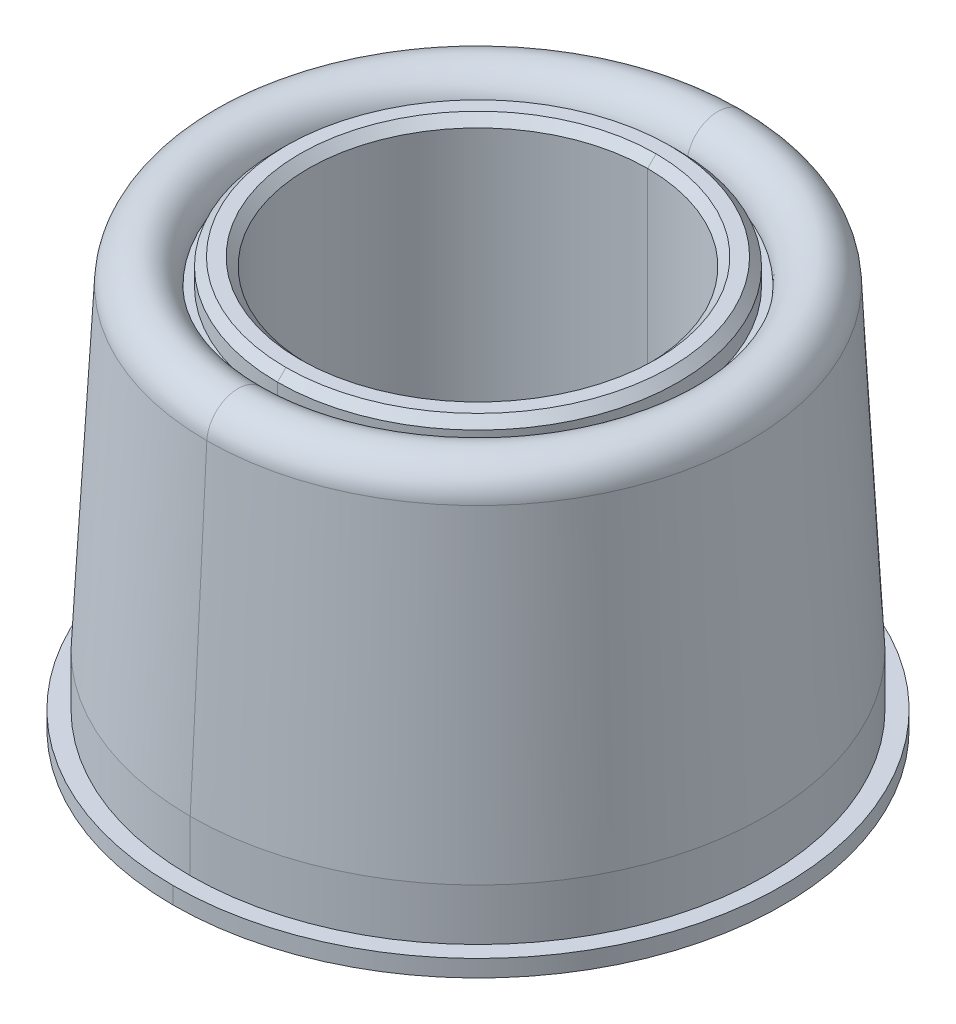
ISO-10303-21;
HEADER;
FILE_DESCRIPTION(('STEP AP214'),'2;1');
FILE_NAME('part.step','',(''),(''),'','','');
FILE_SCHEMA(('AUTOMOTIVE_DESIGN { 1 0 10303 214 1 1 1 1 }'));
ENDSEC;
DATA;
#1=APPLICATION_CONTEXT('core data for automotive mechanical design processes');
#2=APPLICATION_PROTOCOL_DEFINITION('international standard','automotive_design',2000,#1);
#3=PRODUCT_CONTEXT('',#1,'mechanical');
#4=PRODUCT('Part','Part','',(#3));
#5=PRODUCT_RELATED_PRODUCT_CATEGORY('part','',(#4));
#6=PRODUCT_DEFINITION_FORMATION('','',#4);
#7=PRODUCT_DEFINITION_CONTEXT('part definition',#1,'design');
#8=PRODUCT_DEFINITION('design','',#6,#7);
#9=PRODUCT_DEFINITION_SHAPE('','',#8);
#10=(LENGTH_UNIT() NAMED_UNIT(*) SI_UNIT(.MILLI.,.METRE.));
#11=(NAMED_UNIT(*) PLANE_ANGLE_UNIT() SI_UNIT($,.RADIAN.));
#12=(NAMED_UNIT(*) SI_UNIT($,.STERADIAN.) SOLID_ANGLE_UNIT());
#13=UNCERTAINTY_MEASURE_WITH_UNIT(LENGTH_MEASURE(1.E-05),#10,'distance_accuracy_value','');
#14=(GEOMETRIC_REPRESENTATION_CONTEXT(3) GLOBAL_UNCERTAINTY_ASSIGNED_CONTEXT((#13)) GLOBAL_UNIT_ASSIGNED_CONTEXT((#10,
#11,#12)) REPRESENTATION_CONTEXT('',''));
#15=CARTESIAN_POINT('',(0.,0.,0.));
#16=DIRECTION('',(0.,0.,1.));
#17=DIRECTION('',(1.,0.,0.));
#18=AXIS2_PLACEMENT_3D('',#15,#16,#17);
#19=CARTESIAN_POINT('',(0.,9.0424,0.));
#20=DIRECTION('',(0.,1.,0.));
#21=DIRECTION('',(0.,0.,1.));
#22=AXIS2_PLACEMENT_3D('',#19,#20,#21);
#23=CONICAL_SURFACE('',#22,8.34771,0.785398163397443);
#24=DIRECTION('',(0.,0.707106781186551,-0.707106781186545));
#25=VECTOR('',#24,1.);
#26=CARTESIAN_POINT('',(0.,9.0424,-8.34771));
#27=LINE('',#26,#25);
#28=CARTESIAN_POINT('',(0.,8.64489,-7.9502));
#29=VERTEX_POINT('',#28);
#30=CARTESIAN_POINT('',(0.,9.0424,-8.34771));
#31=VERTEX_POINT('',#30);
#32=EDGE_CURVE('E411',#29,#31,#27,.T.);
#33=ORIENTED_EDGE('',*,*,#32,.F.);
#34=CARTESIAN_POINT('',(0.,8.64489,0.));
#35=DIRECTION('',(0.,1.,0.));
#36=DIRECTION('',(0.,0.,-1.));
#37=AXIS2_PLACEMENT_3D('',#34,#35,#36);
#38=CIRCLE('',#37,7.9502);
#39=CARTESIAN_POINT('',(0.,8.64489,7.9502));
#40=VERTEX_POINT('',#39);
#41=EDGE_CURVE('E19',#40,#29,#38,.T.);
#42=ORIENTED_EDGE('',*,*,#41,.F.);
#43=DIRECTION('',(0.,0.707106781186551,0.707106781186545));
#44=VECTOR('',#43,1.);
#45=CARTESIAN_POINT('',(0.,9.0424,8.34771));
#46=LINE('',#45,#44);
#47=CARTESIAN_POINT('',(0.,9.0424,8.34771));
#48=VERTEX_POINT('',#47);
#49=EDGE_CURVE('E285',#40,#48,#46,.T.);
#50=ORIENTED_EDGE('',*,*,#49,.T.);
#51=CARTESIAN_POINT('',(0.,9.0424,0.));
#52=DIRECTION('',(0.,-1.,0.));
#53=DIRECTION('',(0.,0.,-1.));
#54=AXIS2_PLACEMENT_3D('',#51,#52,#53);
#55=CIRCLE('',#54,8.34771);
#56=EDGE_CURVE('E199',#31,#48,#55,.T.);
#57=ORIENTED_EDGE('',*,*,#56,.F.);
#58=EDGE_LOOP('',(#33,#42,#50,#57));
#59=FACE_BOUND('',#58,.T.);
#60=ADVANCED_FACE('F16',(#59),#23,.F.);
#61=CARTESIAN_POINT('',(0.,-8.64489,0.));
#62=DIRECTION('',(0.,-1.,0.));
#63=DIRECTION('',(0.,0.,-1.));
#64=AXIS2_PLACEMENT_3D('',#61,#62,#63);
#65=CONICAL_SURFACE('',#64,7.9502,0.785398163397457);
#66=DIRECTION('',(0.,-0.707106781186541,0.707106781186554));
#67=VECTOR('',#66,1.);
#68=CARTESIAN_POINT('',(0.,-8.64489,7.9502));
#69=LINE('',#68,#67);
#70=CARTESIAN_POINT('',(0.,-8.64489,7.9502));
#71=VERTEX_POINT('',#70);
#72=CARTESIAN_POINT('',(0.,-9.0424,8.34771));
#73=VERTEX_POINT('',#72);
#74=EDGE_CURVE('E293',#71,#73,#69,.T.);
#75=ORIENTED_EDGE('',*,*,#74,.F.);
#76=CARTESIAN_POINT('',(0.,-8.64489,0.));
#77=DIRECTION('',(0.,-1.,0.));
#78=DIRECTION('',(0.,0.,1.));
#79=AXIS2_PLACEMENT_3D('',#76,#77,#78);
#80=CIRCLE('',#79,7.9502);
#81=CARTESIAN_POINT('',(0.,-8.64489,-7.9502));
#82=VERTEX_POINT('',#81);
#83=EDGE_CURVE('E10',#82,#71,#80,.T.);
#84=ORIENTED_EDGE('',*,*,#83,.F.);
#85=DIRECTION('',(0.,-0.707106781186541,-0.707106781186554));
#86=VECTOR('',#85,1.);
#87=CARTESIAN_POINT('',(0.,-8.64489,-7.9502));
#88=LINE('',#87,#86);
#89=CARTESIAN_POINT('',(0.,-9.0424,-8.34771));
#90=VERTEX_POINT('',#89);
#91=EDGE_CURVE('E292',#82,#90,#88,.T.);
#92=ORIENTED_EDGE('',*,*,#91,.T.);
#93=CARTESIAN_POINT('',(0.,-9.0424,0.));
#94=DIRECTION('',(0.,1.,0.));
#95=DIRECTION('',(0.,0.,1.));
#96=AXIS2_PLACEMENT_3D('',#93,#94,#95);
#97=CIRCLE('',#96,8.34771);
#98=EDGE_CURVE('E205',#73,#90,#97,.T.);
#99=ORIENTED_EDGE('',*,*,#98,.F.);
#100=EDGE_LOOP('',(#75,#84,#92,#99));
#101=FACE_BOUND('',#100,.T.);
#102=ADVANCED_FACE('F399',(#101),#65,.F.);
#103=CARTESIAN_POINT('',(0.,8.64489,0.));
#104=DIRECTION('',(0.,-1.,0.));
#105=DIRECTION('',(0.,0.,-1.));
#106=AXIS2_PLACEMENT_3D('',#103,#104,#105);
#107=CONICAL_SURFACE('',#106,9.398,0.785398163397457);
#108=DIRECTION('',(0.,-0.707106781186541,0.707106781186554));
#109=VECTOR('',#108,1.);
#110=CARTESIAN_POINT('',(0.,8.64489,9.398));
#111=LINE('',#110,#109);
#112=CARTESIAN_POINT('',(0.,9.0424,9.00049));
#113=VERTEX_POINT('',#112);
#114=CARTESIAN_POINT('',(0.,8.64489,9.398));
#115=VERTEX_POINT('',#114);
#116=EDGE_CURVE('E304',#113,#115,#111,.T.);
#117=ORIENTED_EDGE('',*,*,#116,.F.);
#118=CARTESIAN_POINT('',(0.,9.0424,0.));
#119=DIRECTION('',(0.,1.,0.));
#120=DIRECTION('',(0.,0.,-1.));
#121=AXIS2_PLACEMENT_3D('',#118,#119,#120);
#122=CIRCLE('',#121,9.00049);
#123=CARTESIAN_POINT('',(0.,9.0424,-9.00049));
#124=VERTEX_POINT('',#123);
#125=EDGE_CURVE('E198',#124,#113,#122,.T.);
#126=ORIENTED_EDGE('',*,*,#125,.F.);
#127=DIRECTION('',(0.,-0.707106781186541,-0.707106781186554));
#128=VECTOR('',#127,1.);
#129=CARTESIAN_POINT('',(0.,8.64489,-9.398));
#130=LINE('',#129,#128);
#131=CARTESIAN_POINT('',(0.,8.64489,-9.398));
#132=VERTEX_POINT('',#131);
#133=EDGE_CURVE('E309',#124,#132,#130,.T.);
#134=ORIENTED_EDGE('',*,*,#133,.T.);
#135=CARTESIAN_POINT('',(0.,8.64489,0.));
#136=DIRECTION('',(0.,-1.,0.));
#137=DIRECTION('',(0.,0.,-1.));
#138=AXIS2_PLACEMENT_3D('',#135,#136,#137);
#139=CIRCLE('',#138,9.398);
#140=EDGE_CURVE('E195',#115,#132,#139,.T.);
#141=ORIENTED_EDGE('',*,*,#140,.F.);
#142=EDGE_LOOP('',(#117,#126,#134,#141));
#143=FACE_BOUND('',#142,.T.);
#144=ADVANCED_FACE('F404',(#143),#107,.T.);
#145=CARTESIAN_POINT('',(0.,-9.0424,0.));
#146=DIRECTION('',(0.,1.,0.));
#147=DIRECTION('',(0.,0.,1.));
#148=AXIS2_PLACEMENT_3D('',#145,#146,#147);
#149=CONICAL_SURFACE('',#148,9.00049,0.785398163397446);
#150=DIRECTION('',(0.,0.707106781186549,-0.707106781186546));
#151=VECTOR('',#150,1.);
#152=CARTESIAN_POINT('',(0.,-9.0424,-9.00049));
#153=LINE('',#152,#151);
#154=CARTESIAN_POINT('',(0.,-9.0424,-9.00049));
#155=VERTEX_POINT('',#154);
#156=CARTESIAN_POINT('',(0.,-8.64489,-9.398));
#157=VERTEX_POINT('',#156);
#158=EDGE_CURVE('E316',#155,#157,#153,.T.);
#159=ORIENTED_EDGE('',*,*,#158,.F.);
#160=CARTESIAN_POINT('',(0.,-9.0424,0.));
#161=DIRECTION('',(0.,-1.,0.));
#162=DIRECTION('',(0.,0.,1.));
#163=AXIS2_PLACEMENT_3D('',#160,#161,#162);
#164=CIRCLE('',#163,9.00049);
#165=CARTESIAN_POINT('',(0.,-9.0424,9.00049));
#166=VERTEX_POINT('',#165);
#167=EDGE_CURVE('E202',#166,#155,#164,.T.);
#168=ORIENTED_EDGE('',*,*,#167,.F.);
#169=DIRECTION('',(0.,0.707106781186549,0.707106781186546));
#170=VECTOR('',#169,1.);
#171=CARTESIAN_POINT('',(0.,-9.0424,9.00049));
#172=LINE('',#171,#170);
#173=CARTESIAN_POINT('',(0.,-8.64489,9.398));
#174=VERTEX_POINT('',#173);
#175=EDGE_CURVE('E317',#166,#174,#172,.T.);
#176=ORIENTED_EDGE('',*,*,#175,.T.);
#177=CARTESIAN_POINT('',(0.,-8.64489,0.));
#178=DIRECTION('',(0.,1.,0.));
#179=DIRECTION('',(0.,0.,1.));
#180=AXIS2_PLACEMENT_3D('',#177,#178,#179);
#181=CIRCLE('',#180,9.398);
#182=EDGE_CURVE('E326',#157,#174,#181,.T.);
#183=ORIENTED_EDGE('',*,*,#182,.F.);
#184=EDGE_LOOP('',(#159,#168,#176,#183));
#185=FACE_BOUND('',#184,.T.);
#186=ADVANCED_FACE('F496',(#185),#149,.T.);
#187=CARTESIAN_POINT('',(0.,-9.0424,0.));
#188=DIRECTION('',(0.,-1.,0.));
#189=DIRECTION('',(0.,0.,-1.));
#190=AXIS2_PLACEMENT_3D('',#187,#188,#189);
#191=CYLINDRICAL_SURFACE('',#190,7.9502);
#192=DIRECTION('',(0.,-1.,0.));
#193=VECTOR('',#192,1.);
#194=CARTESIAN_POINT('',(0.,-9.0424,7.9502));
#195=LINE('',#194,#193);
#196=EDGE_CURVE('E321',#40,#71,#195,.T.);
#197=ORIENTED_EDGE('',*,*,#196,.F.);
#198=ORIENTED_EDGE('',*,*,#41,.T.);
#199=DIRECTION('',(0.,-1.,0.));
#200=VECTOR('',#199,1.);
#201=CARTESIAN_POINT('',(0.,-9.0424,-7.9502));
#202=LINE('',#201,#200);
#203=EDGE_CURVE('E344',#29,#82,#202,.T.);
#204=ORIENTED_EDGE('',*,*,#203,.T.);
#205=ORIENTED_EDGE('',*,*,#83,.T.);
#206=EDGE_LOOP('',(#197,#198,#204,#205));
#207=FACE_BOUND('',#206,.T.);
#208=ADVANCED_FACE('F505',(#207),#191,.F.);
#209=CARTESIAN_POINT('',(-9.398,-9.0424,0.));
#210=DIRECTION('',(0.,1.,0.));
#211=DIRECTION('',(1.,0.,0.));
#212=AXIS2_PLACEMENT_3D('',#209,#210,#211);
#213=PLANE('',#212);
#214=CARTESIAN_POINT('',(0.,-9.0424,0.));
#215=DIRECTION('',(0.,1.,0.));
#216=DIRECTION('',(0.,0.,1.));
#217=AXIS2_PLACEMENT_3D('',#214,#215,#216);
#218=CIRCLE('',#217,8.34771);
#219=EDGE_CURVE('E289',#90,#73,#218,.T.);
#220=ORIENTED_EDGE('',*,*,#219,.T.);
#221=ORIENTED_EDGE('',*,*,#98,.T.);
#222=EDGE_LOOP('',(#220,#221));
#223=FACE_BOUND('',#222,.T.);
#224=ORIENTED_EDGE('',*,*,#167,.T.);
#225=CARTESIAN_POINT('',(0.,-9.0424,0.));
#226=DIRECTION('',(0.,-1.,0.));
#227=DIRECTION('',(0.,0.,1.));
#228=AXIS2_PLACEMENT_3D('',#225,#226,#227);
#229=CIRCLE('',#228,9.00049);
#230=EDGE_CURVE('E313',#155,#166,#229,.T.);
#231=ORIENTED_EDGE('',*,*,#230,.T.);
#232=EDGE_LOOP('',(#224,#231));
#233=FACE_BOUND('',#232,.T.);
#234=ADVANCED_FACE('F502',(#223,#233),#213,.F.);
#235=CARTESIAN_POINT('',(-7.9502,9.0424,0.));
#236=DIRECTION('',(0.,-1.,0.));
#237=DIRECTION('',(0.,0.,-1.));
#238=AXIS2_PLACEMENT_3D('',#235,#236,#237);
#239=PLANE('',#238);
#240=CARTESIAN_POINT('',(0.,9.0424,0.));
#241=DIRECTION('',(0.,-1.,0.));
#242=DIRECTION('',(0.,0.,-1.));
#243=AXIS2_PLACEMENT_3D('',#240,#241,#242);
#244=CIRCLE('',#243,8.34771);
#245=EDGE_CURVE('E283',#48,#31,#244,.T.);
#246=ORIENTED_EDGE('',*,*,#245,.T.);
#247=ORIENTED_EDGE('',*,*,#56,.T.);
#248=EDGE_LOOP('',(#246,#247));
#249=FACE_BOUND('',#248,.T.);
#250=ORIENTED_EDGE('',*,*,#125,.T.);
#251=CARTESIAN_POINT('',(0.,9.0424,0.));
#252=DIRECTION('',(0.,1.,0.));
#253=DIRECTION('',(0.,0.,-1.));
#254=AXIS2_PLACEMENT_3D('',#251,#252,#253);
#255=CIRCLE('',#254,9.00049);
#256=EDGE_CURVE('E300',#113,#124,#255,.T.);
#257=ORIENTED_EDGE('',*,*,#256,.T.);
#258=EDGE_LOOP('',(#250,#257));
#259=FACE_BOUND('',#258,.T.);
#260=ADVANCED_FACE('F504',(#249,#259),#239,.F.);
#261=CARTESIAN_POINT('',(0.,-9.0424,0.));
#262=DIRECTION('',(0.,-1.,0.));
#263=DIRECTION('',(0.,0.,-1.));
#264=AXIS2_PLACEMENT_3D('',#261,#262,#263);
#265=CYLINDRICAL_SURFACE('',#264,9.398);
#266=DIRECTION('',(0.,-1.,0.));
#267=VECTOR('',#266,1.);
#268=CARTESIAN_POINT('',(0.,-9.0424,9.398));
#269=LINE('',#268,#267);
#270=CARTESIAN_POINT('',(0.,7.84621904276566,9.398));
#271=VERTEX_POINT('',#270);
#272=EDGE_CURVE('E348',#115,#271,#269,.T.);
#273=ORIENTED_EDGE('',*,*,#272,.F.);
#274=ORIENTED_EDGE('',*,*,#140,.T.);
#275=DIRECTION('',(0.,-1.,0.));
#276=VECTOR('',#275,1.);
#277=CARTESIAN_POINT('',(0.,-9.0424,-9.398));
#278=LINE('',#277,#276);
#279=CARTESIAN_POINT('',(0.,7.84621904276566,-9.398));
#280=VERTEX_POINT('',#279);
#281=EDGE_CURVE('E331',#132,#280,#278,.T.);
#282=ORIENTED_EDGE('',*,*,#281,.T.);
#283=CARTESIAN_POINT('',(0.,7.84621904276566,0.));
#284=DIRECTION('',(0.,1.,0.));
#285=DIRECTION('',(0.,0.,-1.));
#286=AXIS2_PLACEMENT_3D('',#283,#284,#285);
#287=CIRCLE('',#286,9.398);
#288=EDGE_CURVE('E189',#280,#271,#287,.T.);
#289=ORIENTED_EDGE('',*,*,#288,.T.);
#290=EDGE_LOOP('',(#273,#274,#282,#289));
#291=FACE_BOUND('',#290,.T.);
#292=ADVANCED_FACE('F457',(#291),#265,.T.);
#293=CARTESIAN_POINT('',(-9.398,-9.34085,0.));
#294=DIRECTION('',(0.,1.,0.));
#295=DIRECTION('',(1.,0.,0.));
#296=AXIS2_PLACEMENT_3D('',#293,#294,#295);
#297=PLANE('',#296);
#298=CARTESIAN_POINT('',(0.,-9.34085,0.));
#299=DIRECTION('',(0.,-1.,0.));
#300=DIRECTION('',(0.,0.,-1.));
#301=AXIS2_PLACEMENT_3D('',#298,#299,#300);
#302=CIRCLE('',#301,9.398);
#303=CARTESIAN_POINT('',(0.,-9.34085,-9.398));
#304=VERTEX_POINT('',#303);
#305=CARTESIAN_POINT('',(0.,-9.34085,9.398));
#306=VERTEX_POINT('',#305);
#307=EDGE_CURVE('E191',#304,#306,#302,.T.);
#308=ORIENTED_EDGE('',*,*,#307,.F.);
#309=CARTESIAN_POINT('',(0.,-9.34085,0.));
#310=DIRECTION('',(0.,-1.,0.));
#311=DIRECTION('',(0.,0.,-1.));
#312=AXIS2_PLACEMENT_3D('',#309,#310,#311);
#313=CIRCLE('',#312,9.398);
#314=EDGE_CURVE('E359',#306,#304,#313,.T.);
#315=ORIENTED_EDGE('',*,*,#314,.F.);
#316=EDGE_LOOP('',(#308,#315));
#317=FACE_BOUND('',#316,.T.);
#318=CARTESIAN_POINT('',(0.,-9.34085,0.));
#319=DIRECTION('',(0.,-1.,0.));
#320=DIRECTION('',(0.,0.,1.));
#321=AXIS2_PLACEMENT_3D('',#318,#319,#320);
#322=CIRCLE('',#321,9.779);
#323=CARTESIAN_POINT('',(0.,-9.34085,-9.779));
#324=VERTEX_POINT('',#323);
#325=CARTESIAN_POINT('',(0.,-9.34085,9.779));
#326=VERTEX_POINT('',#325);
#327=EDGE_CURVE('E140',#324,#326,#322,.T.);
#328=ORIENTED_EDGE('',*,*,#327,.T.);
#329=CARTESIAN_POINT('',(0.,-9.34085,0.));
#330=DIRECTION('',(0.,-1.,0.));
#331=DIRECTION('',(0.,0.,1.));
#332=AXIS2_PLACEMENT_3D('',#329,#330,#331);
#333=CIRCLE('',#332,9.779);
#334=EDGE_CURVE('E143',#326,#324,#333,.T.);
#335=ORIENTED_EDGE('',*,*,#334,.T.);
#336=EDGE_LOOP('',(#328,#335));
#337=FACE_BOUND('',#336,.T.);
#338=ADVANCED_FACE('F141',(#317,#337),#297,.F.);
#339=CARTESIAN_POINT('',(0.,-9.0424,0.));
#340=DIRECTION('',(0.,-1.,0.));
#341=DIRECTION('',(0.,0.,-1.));
#342=AXIS2_PLACEMENT_3D('',#339,#340,#341);
#343=CYLINDRICAL_SURFACE('',#342,9.398);
#344=DIRECTION('',(0.,-1.,0.));
#345=VECTOR('',#344,1.);
#346=CARTESIAN_POINT('',(0.,-9.0424,9.398));
#347=LINE('',#346,#345);
#348=EDGE_CURVE('E330',#174,#306,#347,.T.);
#349=ORIENTED_EDGE('',*,*,#348,.F.);
#350=CARTESIAN_POINT('',(0.,-8.64489,0.));
#351=DIRECTION('',(0.,1.,0.));
#352=DIRECTION('',(0.,0.,1.));
#353=AXIS2_PLACEMENT_3D('',#350,#351,#352);
#354=CIRCLE('',#353,9.398);
#355=EDGE_CURVE('E322',#174,#157,#354,.T.);
#356=ORIENTED_EDGE('',*,*,#355,.T.);
#357=DIRECTION('',(0.,-1.,0.));
#358=VECTOR('',#357,1.);
#359=CARTESIAN_POINT('',(0.,-9.0424,-9.398));
#360=LINE('',#359,#358);
#361=EDGE_CURVE('E340',#157,#304,#360,.T.);
#362=ORIENTED_EDGE('',*,*,#361,.T.);
#363=ORIENTED_EDGE('',*,*,#307,.T.);
#364=EDGE_LOOP('',(#349,#356,#362,#363));
#365=FACE_BOUND('',#364,.T.);
#366=ADVANCED_FACE('F395',(#365),#343,.F.);
#367=CARTESIAN_POINT('',(-9.779,7.84621904276566,0.));
#368=DIRECTION('',(0.,-1.,0.));
#369=DIRECTION('',(0.,0.,-1.));
#370=AXIS2_PLACEMENT_3D('',#367,#368,#369);
#371=PLANE('',#370);
#372=ORIENTED_EDGE('',*,*,#288,.F.);
#373=CARTESIAN_POINT('',(0.,7.84621904276566,0.));
#374=DIRECTION('',(0.,1.,0.));
#375=DIRECTION('',(0.,0.,-1.));
#376=AXIS2_PLACEMENT_3D('',#373,#374,#375);
#377=CIRCLE('',#376,9.398);
#378=EDGE_CURVE('E352',#271,#280,#377,.T.);
#379=ORIENTED_EDGE('',*,*,#378,.F.);
#380=EDGE_LOOP('',(#372,#379));
#381=FACE_BOUND('',#380,.T.);
#382=CARTESIAN_POINT('',(0.,7.84621904276566,0.));
#383=DIRECTION('',(0.,-1.,0.));
#384=DIRECTION('',(0.,0.,-1.));
#385=AXIS2_PLACEMENT_3D('',#382,#383,#384);
#386=CIRCLE('',#385,9.779);
#387=CARTESIAN_POINT('',(0.,7.84621904276566,-9.779));
#388=VERTEX_POINT('',#387);
#389=CARTESIAN_POINT('',(0.,7.84621904276566,9.779));
#390=VERTEX_POINT('',#389);
#391=EDGE_CURVE('E263',#388,#390,#386,.T.);
#392=ORIENTED_EDGE('',*,*,#391,.F.);
#393=CARTESIAN_POINT('',(0.,7.84621904276566,0.));
#394=DIRECTION('',(0.,-1.,0.));
#395=DIRECTION('',(0.,0.,-1.));
#396=AXIS2_PLACEMENT_3D('',#393,#394,#395);
#397=CIRCLE('',#396,9.779);
#398=EDGE_CURVE('E175',#390,#388,#397,.T.);
#399=ORIENTED_EDGE('',*,*,#398,.F.);
#400=EDGE_LOOP('',(#392,#399));
#401=FACE_BOUND('',#400,.T.);
#402=ADVANCED_FACE('F385',(#381,#401),#371,.F.);
#403=CARTESIAN_POINT('',(0.,-9.4535625,0.));
#404=DIRECTION('',(0.,-1.,0.));
#405=DIRECTION('',(0.,0.,-1.));
#406=AXIS2_PLACEMENT_3D('',#403,#404,#405);
#407=CYLINDRICAL_SURFACE('',#406,14.2875);
#408=DIRECTION('',(0.,-1.,0.));
#409=VECTOR('',#408,1.);
#410=CARTESIAN_POINT('',(0.,-9.4535625,14.2875));
#411=LINE('',#410,#409);
#412=CARTESIAN_POINT('',(0.,-9.34085,14.2875));
#413=VERTEX_POINT('',#412);
#414=CARTESIAN_POINT('',(0.,-10.1346,14.2875));
#415=VERTEX_POINT('',#414);
#416=EDGE_CURVE('E339',#413,#415,#411,.T.);
#417=ORIENTED_EDGE('',*,*,#416,.F.);
#418=CARTESIAN_POINT('',(0.,-9.34085,0.));
#419=DIRECTION('',(0.,-1.,0.));
#420=DIRECTION('',(0.,0.,-1.));
#421=AXIS2_PLACEMENT_3D('',#418,#419,#420);
#422=CIRCLE('',#421,14.2875);
#423=CARTESIAN_POINT('',(0.,-9.34085,-14.2875));
#424=VERTEX_POINT('',#423);
#425=EDGE_CURVE('E186',#413,#424,#422,.T.);
#426=ORIENTED_EDGE('',*,*,#425,.T.);
#427=DIRECTION('',(0.,-1.,0.));
#428=VECTOR('',#427,1.);
#429=CARTESIAN_POINT('',(0.,-9.4535625,-14.2875));
#430=LINE('',#429,#428);
#431=CARTESIAN_POINT('',(0.,-10.1346,-14.2875));
#432=VERTEX_POINT('',#431);
#433=EDGE_CURVE('E229',#424,#432,#430,.T.);
#434=ORIENTED_EDGE('',*,*,#433,.T.);
#435=CARTESIAN_POINT('',(0.,-10.1346,0.));
#436=DIRECTION('',(0.,-1.,0.));
#437=DIRECTION('',(0.,0.,-1.));
#438=AXIS2_PLACEMENT_3D('',#435,#436,#437);
#439=CIRCLE('',#438,14.2875);
#440=EDGE_CURVE('E172',#415,#432,#439,.T.);
#441=ORIENTED_EDGE('',*,*,#440,.F.);
#442=EDGE_LOOP('',(#417,#426,#434,#441));
#443=FACE_BOUND('',#442,.T.);
#444=ADVANCED_FACE('F383',(#443),#407,.T.);
#445=CARTESIAN_POINT('',(-14.2875,-9.34085,0.));
#446=DIRECTION('',(0.,-1.,0.));
#447=DIRECTION('',(0.,0.,-1.));
#448=AXIS2_PLACEMENT_3D('',#445,#446,#447);
#449=PLANE('',#448);
#450=CARTESIAN_POINT('',(0.,-9.34085,0.));
#451=DIRECTION('',(0.,-1.,0.));
#452=DIRECTION('',(0.,0.,-1.));
#453=AXIS2_PLACEMENT_3D('',#450,#451,#452);
#454=CIRCLE('',#453,13.4874);
#455=CARTESIAN_POINT('',(0.,-9.34085,-13.4874));
#456=VERTEX_POINT('',#455);
#457=CARTESIAN_POINT('',(0.,-9.34085,13.4874));
#458=VERTEX_POINT('',#457);
#459=EDGE_CURVE('E240',#456,#458,#454,.T.);
#460=ORIENTED_EDGE('',*,*,#459,.T.);
#461=CARTESIAN_POINT('',(0.,-9.34085,0.));
#462=DIRECTION('',(0.,-1.,0.));
#463=DIRECTION('',(0.,0.,-1.));
#464=AXIS2_PLACEMENT_3D('',#461,#462,#463);
#465=CIRCLE('',#464,13.4874);
#466=EDGE_CURVE('E183',#458,#456,#465,.T.);
#467=ORIENTED_EDGE('',*,*,#466,.T.);
#468=EDGE_LOOP('',(#460,#467));
#469=FACE_BOUND('',#468,.T.);
#470=CARTESIAN_POINT('',(0.,-9.34085,0.));
#471=DIRECTION('',(0.,-1.,0.));
#472=DIRECTION('',(0.,0.,-1.));
#473=AXIS2_PLACEMENT_3D('',#470,#471,#472);
#474=CIRCLE('',#473,14.2875);
#475=EDGE_CURVE('E335',#424,#413,#474,.T.);
#476=ORIENTED_EDGE('',*,*,#475,.F.);
#477=ORIENTED_EDGE('',*,*,#425,.F.);
#478=EDGE_LOOP('',(#476,#477));
#479=FACE_BOUND('',#478,.T.);
#480=ADVANCED_FACE('F382',(#469,#479),#449,.F.);
#481=CARTESIAN_POINT('',(0.,-9.4535625,0.));
#482=DIRECTION('',(0.,-1.,0.));
#483=DIRECTION('',(0.,0.,-1.));
#484=AXIS2_PLACEMENT_3D('',#481,#482,#483);
#485=CYLINDRICAL_SURFACE('',#484,13.4874);
#486=DIRECTION('',(0.,-1.,0.));
#487=VECTOR('',#486,1.);
#488=CARTESIAN_POINT('',(0.,-9.4535625,13.4874));
#489=LINE('',#488,#487);
#490=CARTESIAN_POINT('',(0.,-6.92785,13.4874));
#491=VERTEX_POINT('',#490);
#492=EDGE_CURVE('E236',#491,#458,#489,.T.);
#493=ORIENTED_EDGE('',*,*,#492,.F.);
#494=CARTESIAN_POINT('',(0.,-6.92785,0.));
#495=DIRECTION('',(0.,-1.,0.));
#496=DIRECTION('',(0.,0.,-1.));
#497=AXIS2_PLACEMENT_3D('',#494,#495,#496);
#498=CIRCLE('',#497,13.4874);
#499=CARTESIAN_POINT('',(0.,-6.92785,-13.4874));
#500=VERTEX_POINT('',#499);
#501=EDGE_CURVE('E182',#491,#500,#498,.T.);
#502=ORIENTED_EDGE('',*,*,#501,.T.);
#503=DIRECTION('',(0.,-1.,0.));
#504=VECTOR('',#503,1.);
#505=CARTESIAN_POINT('',(0.,-9.4535625,-13.4874));
#506=LINE('',#505,#504);
#507=EDGE_CURVE('E246',#500,#456,#506,.T.);
#508=ORIENTED_EDGE('',*,*,#507,.T.);
#509=ORIENTED_EDGE('',*,*,#466,.F.);
#510=EDGE_LOOP('',(#493,#502,#508,#509));
#511=FACE_BOUND('',#510,.T.);
#512=ADVANCED_FACE('F392',(#511),#485,.T.);
#513=CARTESIAN_POINT('',(0.,7.92294648319318,0.));
#514=DIRECTION('',(0.,-1.,0.));
#515=DIRECTION('',(0.,0.,-1.));
#516=AXIS2_PLACEMENT_3D('',#513,#514,#515);
#517=CONICAL_SURFACE('',#516,12.7091027357314,0.0523598775598306);
#518=DIRECTION('',(0.,-0.998629534754574,0.0523359562429439));
#519=VECTOR('',#518,1.);
#520=CARTESIAN_POINT('',(0.,7.92294648319318,12.7091027357314));
#521=LINE('',#520,#519);
#522=CARTESIAN_POINT('',(0.,7.92294648319318,12.7091027357314));
#523=VERTEX_POINT('',#522);
#524=EDGE_CURVE('E254',#523,#491,#521,.T.);
#525=ORIENTED_EDGE('',*,*,#524,.F.);
#526=CARTESIAN_POINT('',(0.,7.92294648319318,0.));
#527=DIRECTION('',(0.,-1.,0.));
#528=DIRECTION('',(0.,0.,-1.));
#529=AXIS2_PLACEMENT_3D('',#526,#527,#528);
#530=CIRCLE('',#529,12.7091027357314);
#531=CARTESIAN_POINT('',(0.,7.92294648319318,-12.7091027357314));
#532=VERTEX_POINT('',#531);
#533=EDGE_CURVE('E178',#523,#532,#530,.T.);
#534=ORIENTED_EDGE('',*,*,#533,.T.);
#535=DIRECTION('',(0.,-0.998629534754574,-0.0523359562429439));
#536=VECTOR('',#535,1.);
#537=CARTESIAN_POINT('',(0.,7.92294648319318,-12.7091027357314));
#538=LINE('',#537,#536);
#539=EDGE_CURVE('E258',#532,#500,#538,.T.);
#540=ORIENTED_EDGE('',*,*,#539,.T.);
#541=ORIENTED_EDGE('',*,*,#501,.F.);
#542=EDGE_LOOP('',(#525,#534,#540,#541));
#543=FACE_BOUND('',#542,.T.);
#544=ADVANCED_FACE('F464',(#543),#517,.T.);
#545=CARTESIAN_POINT('',(0.,7.84621904276566,0.));
#546=DIRECTION('',(0.,-1.,0.));
#547=DIRECTION('',(0.,0.,-1.));
#548=AXIS2_PLACEMENT_3D('',#545,#546,#547);
#549=TOROIDAL_SURFACE('',#548,11.2450559572343,1.46605595723434);
#550=CARTESIAN_POINT('',(0.,7.84621904276566,11.2450559572343));
#551=DIRECTION('',(1.,0.,0.));
#552=DIRECTION('',(0.,0.,-1.));
#553=AXIS2_PLACEMENT_3D('',#550,#551,#552);
#554=CIRCLE('',#553,1.46605595723434);
#555=EDGE_CURVE('E164',#390,#523,#554,.T.);
#556=ORIENTED_EDGE('',*,*,#555,.F.);
#557=ORIENTED_EDGE('',*,*,#398,.T.);
#558=CARTESIAN_POINT('',(0.,7.84621904276566,-11.2450559572343));
#559=DIRECTION('',(-1.,0.,0.));
#560=DIRECTION('',(0.,0.,1.));
#561=AXIS2_PLACEMENT_3D('',#558,#559,#560);
#562=CIRCLE('',#561,1.46605595723434);
#563=EDGE_CURVE('E158',#388,#532,#562,.T.);
#564=ORIENTED_EDGE('',*,*,#563,.T.);
#565=ORIENTED_EDGE('',*,*,#533,.F.);
#566=EDGE_LOOP('',(#556,#557,#564,#565));
#567=FACE_BOUND('',#566,.T.);
#568=ADVANCED_FACE('F461',(#567),#549,.T.);
#569=CARTESIAN_POINT('',(-9.779,-10.1346,0.));
#570=DIRECTION('',(0.,1.,0.));
#571=DIRECTION('',(1.,0.,0.));
#572=AXIS2_PLACEMENT_3D('',#569,#570,#571);
#573=PLANE('',#572);
#574=CARTESIAN_POINT('',(0.,-10.1346,0.));
#575=DIRECTION('',(0.,-1.,0.));
#576=DIRECTION('',(0.,0.,-1.));
#577=AXIS2_PLACEMENT_3D('',#574,#575,#576);
#578=CIRCLE('',#577,9.779);
#579=CARTESIAN_POINT('',(0.,-10.1346,-9.779));
#580=VERTEX_POINT('',#579);
#581=CARTESIAN_POINT('',(0.,-10.1346,9.779));
#582=VERTEX_POINT('',#581);
#583=EDGE_CURVE('E37',#580,#582,#578,.T.);
#584=ORIENTED_EDGE('',*,*,#583,.F.);
#585=CARTESIAN_POINT('',(0.,-10.1346,0.));
#586=DIRECTION('',(0.,-1.,0.));
#587=DIRECTION('',(0.,0.,-1.));
#588=AXIS2_PLACEMENT_3D('',#585,#586,#587);
#589=CIRCLE('',#588,9.779);
#590=EDGE_CURVE('E154',#582,#580,#589,.T.);
#591=ORIENTED_EDGE('',*,*,#590,.F.);
#592=EDGE_LOOP('',(#584,#591));
#593=FACE_BOUND('',#592,.T.);
#594=CARTESIAN_POINT('',(0.,-10.1346,0.));
#595=DIRECTION('',(0.,-1.,0.));
#596=DIRECTION('',(0.,0.,-1.));
#597=AXIS2_PLACEMENT_3D('',#594,#595,#596);
#598=CIRCLE('',#597,14.2875);
#599=EDGE_CURVE('E227',#432,#415,#598,.T.);
#600=ORIENTED_EDGE('',*,*,#599,.T.);
#601=ORIENTED_EDGE('',*,*,#440,.T.);
#602=EDGE_LOOP('',(#600,#601));
#603=FACE_BOUND('',#602,.T.);
#604=ADVANCED_FACE('F376',(#593,#603),#573,.F.);
#605=CARTESIAN_POINT('',(0.,-9.4535625,0.));
#606=DIRECTION('',(0.,-1.,0.));
#607=DIRECTION('',(0.,0.,-1.));
#608=AXIS2_PLACEMENT_3D('',#605,#606,#607);
#609=CYLINDRICAL_SURFACE('',#608,9.779);
#610=DIRECTION('',(0.,-1.,0.));
#611=VECTOR('',#610,1.);
#612=CARTESIAN_POINT('',(0.,-9.4535625,9.779));
#613=LINE('',#612,#611);
#614=EDGE_CURVE('E149',#326,#582,#613,.T.);
#615=ORIENTED_EDGE('',*,*,#614,.F.);
#616=ORIENTED_EDGE('',*,*,#327,.F.);
#617=DIRECTION('',(0.,-1.,0.));
#618=VECTOR('',#617,1.);
#619=CARTESIAN_POINT('',(0.,-9.4535625,-9.779));
#620=LINE('',#619,#618);
#621=EDGE_CURVE('E146',#324,#580,#620,.T.);
#622=ORIENTED_EDGE('',*,*,#621,.T.);
#623=ORIENTED_EDGE('',*,*,#583,.T.);
#624=EDGE_LOOP('',(#615,#616,#622,#623));
#625=FACE_BOUND('',#624,.T.);
#626=ADVANCED_FACE('F150',(#625),#609,.F.);
#627=CARTESIAN_POINT('',(0.,-9.4535625,0.));
#628=DIRECTION('',(0.,-1.,0.));
#629=DIRECTION('',(0.,0.,-1.));
#630=AXIS2_PLACEMENT_3D('',#627,#628,#629);
#631=CYLINDRICAL_SURFACE('',#630,9.779);
#632=ORIENTED_EDGE('',*,*,#334,.F.);
#633=ORIENTED_EDGE('',*,*,#614,.T.);
#634=ORIENTED_EDGE('',*,*,#590,.T.);
#635=ORIENTED_EDGE('',*,*,#621,.F.);
#636=EDGE_LOOP('',(#632,#633,#634,#635));
#637=FACE_BOUND('',#636,.T.);
#638=ADVANCED_FACE('F156',(#637),#631,.F.);
#639=CARTESIAN_POINT('',(0.,7.84621904276566,0.));
#640=DIRECTION('',(0.,-1.,0.));
#641=DIRECTION('',(0.,0.,-1.));
#642=AXIS2_PLACEMENT_3D('',#639,#640,#641);
#643=TOROIDAL_SURFACE('',#642,11.2450559572343,1.46605595723434);
#644=ORIENTED_EDGE('',*,*,#391,.T.);
#645=ORIENTED_EDGE('',*,*,#555,.T.);
#646=CARTESIAN_POINT('',(0.,7.92294648319318,0.));
#647=DIRECTION('',(0.,-1.,0.));
#648=DIRECTION('',(0.,0.,-1.));
#649=AXIS2_PLACEMENT_3D('',#646,#647,#648);
#650=CIRCLE('',#649,12.7091027357314);
#651=EDGE_CURVE('E250',#532,#523,#650,.T.);
#652=ORIENTED_EDGE('',*,*,#651,.F.);
#653=ORIENTED_EDGE('',*,*,#563,.F.);
#654=EDGE_LOOP('',(#644,#645,#652,#653));
#655=FACE_BOUND('',#654,.T.);
#656=ADVANCED_FACE('F528',(#655),#643,.T.);
#657=CARTESIAN_POINT('',(0.,7.92294648319318,0.));
#658=DIRECTION('',(0.,-1.,0.));
#659=DIRECTION('',(0.,0.,-1.));
#660=AXIS2_PLACEMENT_3D('',#657,#658,#659);
#661=CONICAL_SURFACE('',#660,12.7091027357314,0.0523598775598306);
#662=ORIENTED_EDGE('',*,*,#651,.T.);
#663=ORIENTED_EDGE('',*,*,#524,.T.);
#664=CARTESIAN_POINT('',(0.,-6.92785,0.));
#665=DIRECTION('',(0.,-1.,0.));
#666=DIRECTION('',(0.,0.,-1.));
#667=AXIS2_PLACEMENT_3D('',#664,#665,#666);
#668=CIRCLE('',#667,13.4874);
#669=EDGE_CURVE('E232',#500,#491,#668,.T.);
#670=ORIENTED_EDGE('',*,*,#669,.F.);
#671=ORIENTED_EDGE('',*,*,#539,.F.);
#672=EDGE_LOOP('',(#662,#663,#670,#671));
#673=FACE_BOUND('',#672,.T.);
#674=ADVANCED_FACE('F525',(#673),#661,.T.);
#675=CARTESIAN_POINT('',(0.,-9.4535625,0.));
#676=DIRECTION('',(0.,-1.,0.));
#677=DIRECTION('',(0.,0.,-1.));
#678=AXIS2_PLACEMENT_3D('',#675,#676,#677);
#679=CYLINDRICAL_SURFACE('',#678,13.4874);
#680=ORIENTED_EDGE('',*,*,#669,.T.);
#681=ORIENTED_EDGE('',*,*,#492,.T.);
#682=ORIENTED_EDGE('',*,*,#459,.F.);
#683=ORIENTED_EDGE('',*,*,#507,.F.);
#684=EDGE_LOOP('',(#680,#681,#682,#683));
#685=FACE_BOUND('',#684,.T.);
#686=ADVANCED_FACE('F524',(#685),#679,.T.);
#687=CARTESIAN_POINT('',(0.,-9.4535625,0.));
#688=DIRECTION('',(0.,-1.,0.));
#689=DIRECTION('',(0.,0.,-1.));
#690=AXIS2_PLACEMENT_3D('',#687,#688,#689);
#691=CYLINDRICAL_SURFACE('',#690,14.2875);
#692=ORIENTED_EDGE('',*,*,#475,.T.);
#693=ORIENTED_EDGE('',*,*,#416,.T.);
#694=ORIENTED_EDGE('',*,*,#599,.F.);
#695=ORIENTED_EDGE('',*,*,#433,.F.);
#696=EDGE_LOOP('',(#692,#693,#694,#695));
#697=FACE_BOUND('',#696,.T.);
#698=ADVANCED_FACE('F378',(#697),#691,.T.);
#699=CARTESIAN_POINT('',(0.,-9.0424,0.));
#700=DIRECTION('',(0.,-1.,0.));
#701=DIRECTION('',(0.,0.,-1.));
#702=AXIS2_PLACEMENT_3D('',#699,#700,#701);
#703=CYLINDRICAL_SURFACE('',#702,9.398);
#704=ORIENTED_EDGE('',*,*,#182,.T.);
#705=ORIENTED_EDGE('',*,*,#348,.T.);
#706=ORIENTED_EDGE('',*,*,#314,.T.);
#707=ORIENTED_EDGE('',*,*,#361,.F.);
#708=EDGE_LOOP('',(#704,#705,#706,#707));
#709=FACE_BOUND('',#708,.T.);
#710=ADVANCED_FACE('F518',(#709),#703,.F.);
#711=CARTESIAN_POINT('',(0.,-9.0424,0.));
#712=DIRECTION('',(0.,-1.,0.));
#713=DIRECTION('',(0.,0.,-1.));
#714=AXIS2_PLACEMENT_3D('',#711,#712,#713);
#715=CYLINDRICAL_SURFACE('',#714,9.398);
#716=CARTESIAN_POINT('',(0.,8.64489,0.));
#717=DIRECTION('',(0.,-1.,0.));
#718=DIRECTION('',(0.,0.,-1.));
#719=AXIS2_PLACEMENT_3D('',#716,#717,#718);
#720=CIRCLE('',#719,9.398);
#721=EDGE_CURVE('E307',#132,#115,#720,.T.);
#722=ORIENTED_EDGE('',*,*,#721,.T.);
#723=ORIENTED_EDGE('',*,*,#272,.T.);
#724=ORIENTED_EDGE('',*,*,#378,.T.);
#725=ORIENTED_EDGE('',*,*,#281,.F.);
#726=EDGE_LOOP('',(#722,#723,#724,#725));
#727=FACE_BOUND('',#726,.T.);
#728=ADVANCED_FACE('F447',(#727),#715,.T.);
#729=CARTESIAN_POINT('',(0.,-9.0424,0.));
#730=DIRECTION('',(0.,-1.,0.));
#731=DIRECTION('',(0.,0.,-1.));
#732=AXIS2_PLACEMENT_3D('',#729,#730,#731);
#733=CYLINDRICAL_SURFACE('',#732,7.9502);
#734=CARTESIAN_POINT('',(0.,8.64489,0.));
#735=DIRECTION('',(0.,1.,0.));
#736=DIRECTION('',(0.,0.,-1.));
#737=AXIS2_PLACEMENT_3D('',#734,#735,#736);
#738=CIRCLE('',#737,7.9502);
#739=EDGE_CURVE('E422',#29,#40,#738,.T.);
#740=ORIENTED_EDGE('',*,*,#739,.T.);
#741=ORIENTED_EDGE('',*,*,#196,.T.);
#742=CARTESIAN_POINT('',(0.,-8.64489,0.));
#743=DIRECTION('',(0.,-1.,0.));
#744=DIRECTION('',(0.,0.,1.));
#745=AXIS2_PLACEMENT_3D('',#742,#743,#744);
#746=CIRCLE('',#745,7.9502);
#747=EDGE_CURVE('E288',#71,#82,#746,.T.);
#748=ORIENTED_EDGE('',*,*,#747,.T.);
#749=ORIENTED_EDGE('',*,*,#203,.F.);
#750=EDGE_LOOP('',(#740,#741,#748,#749));
#751=FACE_BOUND('',#750,.T.);
#752=ADVANCED_FACE('F545',(#751),#733,.F.);
#753=CARTESIAN_POINT('',(0.,-9.0424,0.));
#754=DIRECTION('',(0.,1.,0.));
#755=DIRECTION('',(0.,0.,1.));
#756=AXIS2_PLACEMENT_3D('',#753,#754,#755);
#757=CONICAL_SURFACE('',#756,9.00049,0.785398163397446);
#758=ORIENTED_EDGE('',*,*,#230,.F.);
#759=ORIENTED_EDGE('',*,*,#158,.T.);
#760=ORIENTED_EDGE('',*,*,#355,.F.);
#761=ORIENTED_EDGE('',*,*,#175,.F.);
#762=EDGE_LOOP('',(#758,#759,#760,#761));
#763=FACE_BOUND('',#762,.T.);
#764=ADVANCED_FACE('F501',(#763),#757,.T.);
#765=CARTESIAN_POINT('',(0.,8.64489,0.));
#766=DIRECTION('',(0.,-1.,0.));
#767=DIRECTION('',(0.,0.,-1.));
#768=AXIS2_PLACEMENT_3D('',#765,#766,#767);
#769=CONICAL_SURFACE('',#768,9.398,0.785398163397457);
#770=ORIENTED_EDGE('',*,*,#256,.F.);
#771=ORIENTED_EDGE('',*,*,#116,.T.);
#772=ORIENTED_EDGE('',*,*,#721,.F.);
#773=ORIENTED_EDGE('',*,*,#133,.F.);
#774=EDGE_LOOP('',(#770,#771,#772,#773));
#775=FACE_BOUND('',#774,.T.);
#776=ADVANCED_FACE('F453',(#775),#769,.T.);
#777=CARTESIAN_POINT('',(0.,-8.64489,0.));
#778=DIRECTION('',(0.,-1.,0.));
#779=DIRECTION('',(0.,0.,-1.));
#780=AXIS2_PLACEMENT_3D('',#777,#778,#779);
#781=CONICAL_SURFACE('',#780,7.9502,0.785398163397457);
#782=ORIENTED_EDGE('',*,*,#747,.F.);
#783=ORIENTED_EDGE('',*,*,#74,.T.);
#784=ORIENTED_EDGE('',*,*,#219,.F.);
#785=ORIENTED_EDGE('',*,*,#91,.F.);
#786=EDGE_LOOP('',(#782,#783,#784,#785));
#787=FACE_BOUND('',#786,.T.);
#788=ADVANCED_FACE('F931',(#787),#781,.F.);
#789=CARTESIAN_POINT('',(0.,9.0424,0.));
#790=DIRECTION('',(0.,1.,0.));
#791=DIRECTION('',(0.,0.,1.));
#792=AXIS2_PLACEMENT_3D('',#789,#790,#791);
#793=CONICAL_SURFACE('',#792,8.34771,0.785398163397443);
#794=ORIENTED_EDGE('',*,*,#739,.F.);
#795=ORIENTED_EDGE('',*,*,#32,.T.);
#796=ORIENTED_EDGE('',*,*,#245,.F.);
#797=ORIENTED_EDGE('',*,*,#49,.F.);
#798=EDGE_LOOP('',(#794,#795,#796,#797));
#799=FACE_BOUND('',#798,.T.);
#800=ADVANCED_FACE('F426',(#799),#793,.F.);
#801=CLOSED_SHELL('',(#60,#102,#144,#186,#208,#234,#260,#292,#338,#366,#402,#444,#480,#512,#544,
#568,#604,#626,#638,#656,#674,#686,#698,#710,#728,#752,#764,#776,#788,#800));
#802=MANIFOLD_SOLID_BREP('B1',#801);
#803=ADVANCED_BREP_SHAPE_REPRESENTATION('',(#18,#802),#14);
#804=SHAPE_DEFINITION_REPRESENTATION(#9,#803);
ENDSEC;
END-ISO-10303-21;
